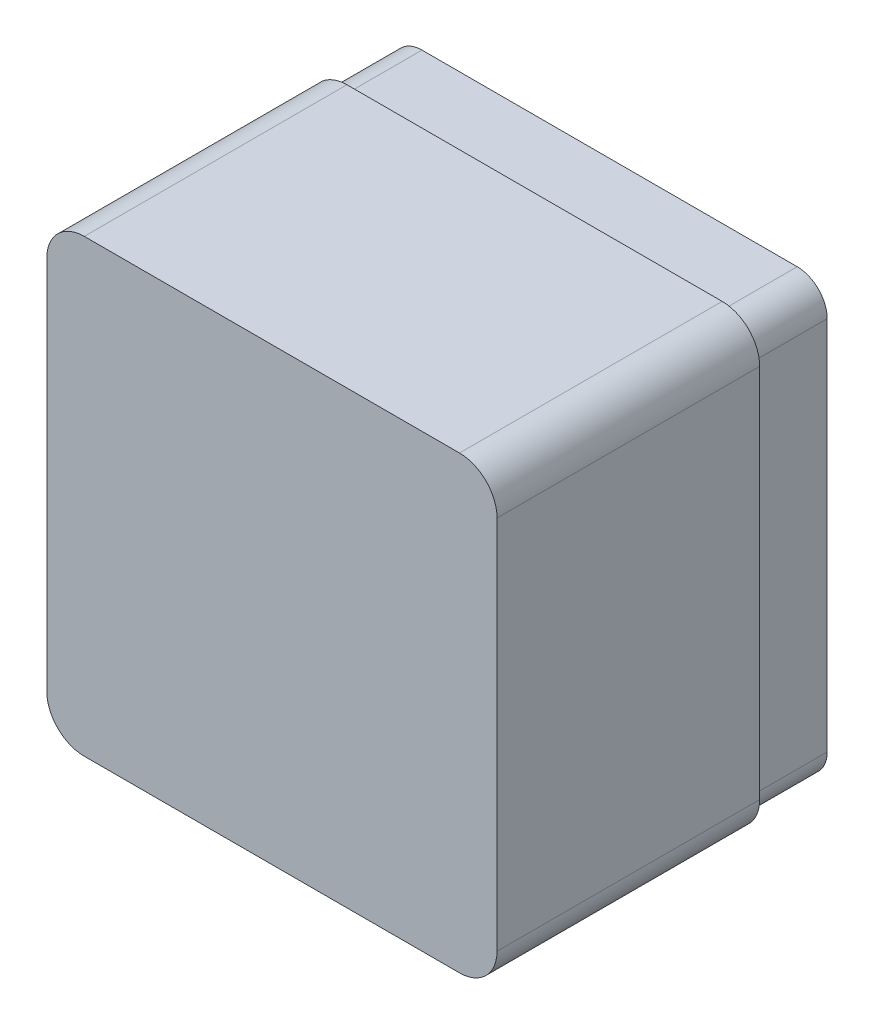
ISO-10303-21;
HEADER;
FILE_DESCRIPTION(('STEP AP214'),'2;1');
FILE_NAME('part.step','',(''),(''),'','','');
FILE_SCHEMA(('AUTOMOTIVE_DESIGN { 1 0 10303 214 1 1 1 1 }'));
ENDSEC;
DATA;
#1=APPLICATION_CONTEXT('core data for automotive mechanical design processes');
#2=APPLICATION_PROTOCOL_DEFINITION('international standard','automotive_design',2000,#1);
#3=PRODUCT_CONTEXT('',#1,'mechanical');
#4=PRODUCT('Part','Part','',(#3));
#5=PRODUCT_RELATED_PRODUCT_CATEGORY('part','',(#4));
#6=PRODUCT_DEFINITION_FORMATION('','',#4);
#7=PRODUCT_DEFINITION_CONTEXT('part definition',#1,'design');
#8=PRODUCT_DEFINITION('design','',#6,#7);
#9=PRODUCT_DEFINITION_SHAPE('','',#8);
#10=(LENGTH_UNIT() NAMED_UNIT(*) SI_UNIT(.MILLI.,.METRE.));
#11=(NAMED_UNIT(*) PLANE_ANGLE_UNIT() SI_UNIT($,.RADIAN.));
#12=(NAMED_UNIT(*) SI_UNIT($,.STERADIAN.) SOLID_ANGLE_UNIT());
#13=UNCERTAINTY_MEASURE_WITH_UNIT(LENGTH_MEASURE(1.E-05),#10,'distance_accuracy_value','');
#14=(GEOMETRIC_REPRESENTATION_CONTEXT(3) GLOBAL_UNCERTAINTY_ASSIGNED_CONTEXT((#13)) GLOBAL_UNIT_ASSIGNED_CONTEXT((#10,
#11,#12)) REPRESENTATION_CONTEXT('',''));
#15=CARTESIAN_POINT('',(0.,0.,0.));
#16=DIRECTION('',(0.,0.,1.));
#17=DIRECTION('',(1.,0.,0.));
#18=AXIS2_PLACEMENT_3D('',#15,#16,#17);
#19=CARTESIAN_POINT('',(0.,0.,0.));
#20=DIRECTION('',(0.,0.,-1.));
#21=DIRECTION('',(-1.,0.,0.));
#22=AXIS2_PLACEMENT_3D('',#19,#20,#21);
#23=PLANE('',#22);
#24=CARTESIAN_POINT('',(-50.,50.,0.));
#25=DIRECTION('',(0.,0.,-1.));
#26=DIRECTION('',(-1.,0.,0.));
#27=AXIS2_PLACEMENT_3D('',#24,#25,#26);
#28=CIRCLE('',#27,6.);
#29=CARTESIAN_POINT('',(-56.,50.,0.));
#30=VERTEX_POINT('',#29);
#31=CARTESIAN_POINT('',(-50.,56.,0.));
#32=VERTEX_POINT('',#31);
#33=EDGE_CURVE('E369',#30,#32,#28,.T.);
#34=ORIENTED_EDGE('',*,*,#33,.F.);
#35=DIRECTION('',(0.,-1.,0.));
#36=VECTOR('',#35,1.);
#37=CARTESIAN_POINT('',(-56.,0.,0.));
#38=LINE('',#37,#36);
#39=CARTESIAN_POINT('',(-56.,-50.,0.));
#40=VERTEX_POINT('',#39);
#41=EDGE_CURVE('E392',#30,#40,#38,.T.);
#42=ORIENTED_EDGE('',*,*,#41,.T.);
#43=CARTESIAN_POINT('',(-50.,-50.,0.));
#44=DIRECTION('',(0.,0.,-1.));
#45=DIRECTION('',(-1.,0.,0.));
#46=AXIS2_PLACEMENT_3D('',#43,#44,#45);
#47=CIRCLE('',#46,6.);
#48=CARTESIAN_POINT('',(-50.,-56.,0.));
#49=VERTEX_POINT('',#48);
#50=EDGE_CURVE('E388',#49,#40,#47,.T.);
#51=ORIENTED_EDGE('',*,*,#50,.F.);
#52=DIRECTION('',(1.,0.,0.));
#53=VECTOR('',#52,1.);
#54=CARTESIAN_POINT('',(0.,-56.,0.));
#55=LINE('',#54,#53);
#56=CARTESIAN_POINT('',(50.,-56.,0.));
#57=VERTEX_POINT('',#56);
#58=EDGE_CURVE('E329',#49,#57,#55,.T.);
#59=ORIENTED_EDGE('',*,*,#58,.T.);
#60=CARTESIAN_POINT('',(50.,-50.,0.));
#61=DIRECTION('',(0.,0.,-1.));
#62=DIRECTION('',(-1.,0.,0.));
#63=AXIS2_PLACEMENT_3D('',#60,#61,#62);
#64=CIRCLE('',#63,6.);
#65=CARTESIAN_POINT('',(56.,-50.,0.));
#66=VERTEX_POINT('',#65);
#67=EDGE_CURVE('E385',#66,#57,#64,.T.);
#68=ORIENTED_EDGE('',*,*,#67,.F.);
#69=DIRECTION('',(0.,1.,0.));
#70=VECTOR('',#69,1.);
#71=CARTESIAN_POINT('',(56.,0.,0.));
#72=LINE('',#71,#70);
#73=CARTESIAN_POINT('',(56.,50.,0.));
#74=VERTEX_POINT('',#73);
#75=EDGE_CURVE('E323',#66,#74,#72,.T.);
#76=ORIENTED_EDGE('',*,*,#75,.T.);
#77=CARTESIAN_POINT('',(50.,50.,0.));
#78=DIRECTION('',(0.,0.,-1.));
#79=DIRECTION('',(-1.,0.,0.));
#80=AXIS2_PLACEMENT_3D('',#77,#78,#79);
#81=CIRCLE('',#80,6.);
#82=CARTESIAN_POINT('',(50.,56.,0.));
#83=VERTEX_POINT('',#82);
#84=EDGE_CURVE('E373',#83,#74,#81,.T.);
#85=ORIENTED_EDGE('',*,*,#84,.F.);
#86=DIRECTION('',(-1.,0.,0.));
#87=VECTOR('',#86,1.);
#88=CARTESIAN_POINT('',(0.,56.,0.));
#89=LINE('',#88,#87);
#90=EDGE_CURVE('E384',#83,#32,#89,.T.);
#91=ORIENTED_EDGE('',*,*,#90,.T.);
#92=EDGE_LOOP('',(#34,#42,#51,#59,#68,#76,#85,#91));
#93=FACE_BOUND('',#92,.T.);
#94=DIRECTION('',(-1.,0.,0.));
#95=VECTOR('',#94,1.);
#96=CARTESIAN_POINT('',(50.,-58.,0.));
#97=LINE('',#96,#95);
#98=CARTESIAN_POINT('',(50.,-58.,0.));
#99=VERTEX_POINT('',#98);
#100=CARTESIAN_POINT('',(-50.,-58.,0.));
#101=VERTEX_POINT('',#100);
#102=EDGE_CURVE('E232',#99,#101,#97,.T.);
#103=ORIENTED_EDGE('',*,*,#102,.T.);
#104=CARTESIAN_POINT('',(-50.,-50.,0.));
#105=DIRECTION('',(0.,0.,-1.));
#106=DIRECTION('',(-1.,0.,0.));
#107=AXIS2_PLACEMENT_3D('',#104,#105,#106);
#108=CIRCLE('',#107,7.99999999999999);
#109=CARTESIAN_POINT('',(-58.,-50.,0.));
#110=VERTEX_POINT('',#109);
#111=EDGE_CURVE('E259',#101,#110,#108,.T.);
#112=ORIENTED_EDGE('',*,*,#111,.T.);
#113=DIRECTION('',(0.,1.,0.));
#114=VECTOR('',#113,1.);
#115=CARTESIAN_POINT('',(-58.,-50.,0.));
#116=LINE('',#115,#114);
#117=CARTESIAN_POINT('',(-58.,50.,0.));
#118=VERTEX_POINT('',#117);
#119=EDGE_CURVE('E209',#110,#118,#116,.T.);
#120=ORIENTED_EDGE('',*,*,#119,.T.);
#121=CARTESIAN_POINT('',(-50.,50.,0.));
#122=DIRECTION('',(0.,0.,-1.));
#123=DIRECTION('',(-1.,0.,0.));
#124=AXIS2_PLACEMENT_3D('',#121,#122,#123);
#125=CIRCLE('',#124,7.99999999999999);
#126=CARTESIAN_POINT('',(-50.,58.,0.));
#127=VERTEX_POINT('',#126);
#128=EDGE_CURVE('E58',#118,#127,#125,.T.);
#129=ORIENTED_EDGE('',*,*,#128,.T.);
#130=DIRECTION('',(1.,0.,0.));
#131=VECTOR('',#130,1.);
#132=CARTESIAN_POINT('',(-50.,58.,0.));
#133=LINE('',#132,#131);
#134=CARTESIAN_POINT('',(50.,58.,0.));
#135=VERTEX_POINT('',#134);
#136=EDGE_CURVE('E266',#127,#135,#133,.T.);
#137=ORIENTED_EDGE('',*,*,#136,.T.);
#138=CARTESIAN_POINT('',(50.,50.,0.));
#139=DIRECTION('',(0.,0.,-1.));
#140=DIRECTION('',(-1.,0.,0.));
#141=AXIS2_PLACEMENT_3D('',#138,#139,#140);
#142=CIRCLE('',#141,7.99999999999999);
#143=CARTESIAN_POINT('',(58.,50.,0.));
#144=VERTEX_POINT('',#143);
#145=EDGE_CURVE('E270',#135,#144,#142,.T.);
#146=ORIENTED_EDGE('',*,*,#145,.T.);
#147=DIRECTION('',(0.,-1.,0.));
#148=VECTOR('',#147,1.);
#149=CARTESIAN_POINT('',(58.,50.,0.));
#150=LINE('',#149,#148);
#151=CARTESIAN_POINT('',(58.,-50.,0.));
#152=VERTEX_POINT('',#151);
#153=EDGE_CURVE('E274',#144,#152,#150,.T.);
#154=ORIENTED_EDGE('',*,*,#153,.T.);
#155=CARTESIAN_POINT('',(50.,-50.,0.));
#156=DIRECTION('',(0.,0.,-1.));
#157=DIRECTION('',(-1.,0.,0.));
#158=AXIS2_PLACEMENT_3D('',#155,#156,#157);
#159=CIRCLE('',#158,7.99999999999999);
#160=EDGE_CURVE('E236',#152,#99,#159,.T.);
#161=ORIENTED_EDGE('',*,*,#160,.T.);
#162=EDGE_LOOP('',(#103,#112,#120,#129,#137,#146,#154,#161));
#163=FACE_BOUND('',#162,.T.);
#164=ADVANCED_FACE('F42',(#93,#163),#23,.T.);
#165=CARTESIAN_POINT('',(56.,-60.,90.));
#166=DIRECTION('',(-1.,0.,0.));
#167=DIRECTION('',(0.,0.,1.));
#168=AXIS2_PLACEMENT_3D('',#165,#166,#167);
#169=PLANE('',#168);
#170=DIRECTION('',(0.,1.,0.));
#171=VECTOR('',#170,1.);
#172=CARTESIAN_POINT('',(56.,0.,86.));
#173=LINE('',#172,#171);
#174=CARTESIAN_POINT('',(56.,-50.,86.));
#175=VERTEX_POINT('',#174);
#176=CARTESIAN_POINT('',(56.,50.,86.));
#177=VERTEX_POINT('',#176);
#178=EDGE_CURVE('E324',#175,#177,#173,.T.);
#179=ORIENTED_EDGE('',*,*,#178,.T.);
#180=DIRECTION('',(0.,0.,1.));
#181=VECTOR('',#180,1.);
#182=CARTESIAN_POINT('',(56.,50.,90.));
#183=LINE('',#182,#181);
#184=EDGE_CURVE('E334',#74,#177,#183,.T.);
#185=ORIENTED_EDGE('',*,*,#184,.F.);
#186=ORIENTED_EDGE('',*,*,#75,.F.);
#187=DIRECTION('',(0.,0.,1.));
#188=VECTOR('',#187,1.);
#189=CARTESIAN_POINT('',(56.,-50.,90.));
#190=LINE('',#189,#188);
#191=EDGE_CURVE('E330',#175,#66,#190,.F.);
#192=ORIENTED_EDGE('',*,*,#191,.F.);
#193=EDGE_LOOP('',(#179,#185,#186,#192));
#194=FACE_BOUND('',#193,.T.);
#195=ADVANCED_FACE('F504',(#194),#169,.T.);
#196=CARTESIAN_POINT('',(-60.,56.,90.));
#197=DIRECTION('',(0.,-1.,0.));
#198=DIRECTION('',(0.,0.,-1.));
#199=AXIS2_PLACEMENT_3D('',#196,#197,#198);
#200=PLANE('',#199);
#201=ORIENTED_EDGE('',*,*,#90,.F.);
#202=DIRECTION('',(0.,0.,-1.));
#203=VECTOR('',#202,1.);
#204=CARTESIAN_POINT('',(50.,56.,90.));
#205=LINE('',#204,#203);
#206=CARTESIAN_POINT('',(50.,56.,86.));
#207=VERTEX_POINT('',#206);
#208=EDGE_CURVE('E366',#207,#83,#205,.T.);
#209=ORIENTED_EDGE('',*,*,#208,.F.);
#210=DIRECTION('',(-1.,0.,0.));
#211=VECTOR('',#210,1.);
#212=CARTESIAN_POINT('',(0.,56.,86.));
#213=LINE('',#212,#211);
#214=CARTESIAN_POINT('',(-50.,56.,86.));
#215=VERTEX_POINT('',#214);
#216=EDGE_CURVE('E328',#207,#215,#213,.T.);
#217=ORIENTED_EDGE('',*,*,#216,.T.);
#218=DIRECTION('',(0.,0.,-1.));
#219=VECTOR('',#218,1.);
#220=CARTESIAN_POINT('',(-50.,56.,90.));
#221=LINE('',#220,#219);
#222=EDGE_CURVE('E363',#32,#215,#221,.F.);
#223=ORIENTED_EDGE('',*,*,#222,.F.);
#224=EDGE_LOOP('',(#201,#209,#217,#223));
#225=FACE_BOUND('',#224,.T.);
#226=ADVANCED_FACE('F509',(#225),#200,.T.);
#227=CARTESIAN_POINT('',(-56.,-60.,90.));
#228=DIRECTION('',(1.,0.,0.));
#229=DIRECTION('',(0.,0.,-1.));
#230=AXIS2_PLACEMENT_3D('',#227,#228,#229);
#231=PLANE('',#230);
#232=DIRECTION('',(0.,-1.,0.));
#233=VECTOR('',#232,1.);
#234=CARTESIAN_POINT('',(-56.,0.,86.));
#235=LINE('',#234,#233);
#236=CARTESIAN_POINT('',(-56.,50.,86.));
#237=VERTEX_POINT('',#236);
#238=CARTESIAN_POINT('',(-56.,-50.,86.));
#239=VERTEX_POINT('',#238);
#240=EDGE_CURVE('E341',#237,#239,#235,.T.);
#241=ORIENTED_EDGE('',*,*,#240,.T.);
#242=DIRECTION('',(0.,0.,-1.));
#243=VECTOR('',#242,1.);
#244=CARTESIAN_POINT('',(-56.,-50.,90.));
#245=LINE('',#244,#243);
#246=EDGE_CURVE('E357',#40,#239,#245,.F.);
#247=ORIENTED_EDGE('',*,*,#246,.F.);
#248=ORIENTED_EDGE('',*,*,#41,.F.);
#249=DIRECTION('',(0.,0.,-1.));
#250=VECTOR('',#249,1.);
#251=CARTESIAN_POINT('',(-56.,50.,90.));
#252=LINE('',#251,#250);
#253=EDGE_CURVE('E370',#237,#30,#252,.T.);
#254=ORIENTED_EDGE('',*,*,#253,.F.);
#255=EDGE_LOOP('',(#241,#247,#248,#254));
#256=FACE_BOUND('',#255,.T.);
#257=ADVANCED_FACE('F702',(#256),#231,.T.);
#258=CARTESIAN_POINT('',(-60.,-56.,90.));
#259=DIRECTION('',(0.,1.,0.));
#260=DIRECTION('',(0.,0.,1.));
#261=AXIS2_PLACEMENT_3D('',#258,#259,#260);
#262=PLANE('',#261);
#263=DIRECTION('',(1.,0.,0.));
#264=VECTOR('',#263,1.);
#265=CARTESIAN_POINT('',(0.,-56.,86.));
#266=LINE('',#265,#264);
#267=CARTESIAN_POINT('',(-50.,-56.,86.));
#268=VERTEX_POINT('',#267);
#269=CARTESIAN_POINT('',(50.,-56.,86.));
#270=VERTEX_POINT('',#269);
#271=EDGE_CURVE('E350',#268,#270,#266,.T.);
#272=ORIENTED_EDGE('',*,*,#271,.T.);
#273=DIRECTION('',(0.,0.,1.));
#274=VECTOR('',#273,1.);
#275=CARTESIAN_POINT('',(50.,-56.,90.));
#276=LINE('',#275,#274);
#277=EDGE_CURVE('E345',#57,#270,#276,.T.);
#278=ORIENTED_EDGE('',*,*,#277,.F.);
#279=ORIENTED_EDGE('',*,*,#58,.F.);
#280=DIRECTION('',(0.,0.,1.));
#281=VECTOR('',#280,1.);
#282=CARTESIAN_POINT('',(-50.,-56.,90.));
#283=LINE('',#282,#281);
#284=EDGE_CURVE('E337',#268,#49,#283,.F.);
#285=ORIENTED_EDGE('',*,*,#284,.F.);
#286=EDGE_LOOP('',(#272,#278,#279,#285));
#287=FACE_BOUND('',#286,.T.);
#288=ADVANCED_FACE('F693',(#287),#262,.T.);
#289=CARTESIAN_POINT('',(0.,0.,86.));
#290=DIRECTION('',(0.,0.,-1.));
#291=DIRECTION('',(-1.,0.,0.));
#292=AXIS2_PLACEMENT_3D('',#289,#290,#291);
#293=PLANE('',#292);
#294=ORIENTED_EDGE('',*,*,#216,.F.);
#295=CARTESIAN_POINT('',(50.,50.,86.));
#296=DIRECTION('',(0.,0.,-1.));
#297=DIRECTION('',(-1.,0.,0.));
#298=AXIS2_PLACEMENT_3D('',#295,#296,#297);
#299=CIRCLE('',#298,6.);
#300=EDGE_CURVE('E360',#177,#207,#299,.F.);
#301=ORIENTED_EDGE('',*,*,#300,.F.);
#302=ORIENTED_EDGE('',*,*,#178,.F.);
#303=CARTESIAN_POINT('',(50.,-50.,86.));
#304=DIRECTION('',(0.,0.,-1.));
#305=DIRECTION('',(-1.,0.,0.));
#306=AXIS2_PLACEMENT_3D('',#303,#304,#305);
#307=CIRCLE('',#306,6.);
#308=EDGE_CURVE('E353',#270,#175,#307,.F.);
#309=ORIENTED_EDGE('',*,*,#308,.F.);
#310=ORIENTED_EDGE('',*,*,#271,.F.);
#311=CARTESIAN_POINT('',(-50.,-50.,86.));
#312=DIRECTION('',(0.,0.,-1.));
#313=DIRECTION('',(-1.,0.,0.));
#314=AXIS2_PLACEMENT_3D('',#311,#312,#313);
#315=CIRCLE('',#314,6.);
#316=EDGE_CURVE('E346',#239,#268,#315,.F.);
#317=ORIENTED_EDGE('',*,*,#316,.F.);
#318=ORIENTED_EDGE('',*,*,#240,.F.);
#319=CARTESIAN_POINT('',(-50.,50.,86.));
#320=DIRECTION('',(0.,0.,-1.));
#321=DIRECTION('',(-1.,0.,0.));
#322=AXIS2_PLACEMENT_3D('',#319,#320,#321);
#323=CIRCLE('',#322,6.);
#324=EDGE_CURVE('E342',#215,#237,#323,.F.);
#325=ORIENTED_EDGE('',*,*,#324,.F.);
#326=EDGE_LOOP('',(#294,#301,#302,#309,#310,#317,#318,#325));
#327=FACE_BOUND('',#326,.T.);
#328=ADVANCED_FACE('F684',(#327),#293,.T.);
#329=CARTESIAN_POINT('',(-50.,50.,90.));
#330=DIRECTION('',(0.,0.,-1.));
#331=DIRECTION('',(-1.,0.,0.));
#332=AXIS2_PLACEMENT_3D('',#329,#330,#331);
#333=CYLINDRICAL_SURFACE('',#332,6.);
#334=ORIENTED_EDGE('',*,*,#324,.T.);
#335=ORIENTED_EDGE('',*,*,#253,.T.);
#336=ORIENTED_EDGE('',*,*,#33,.T.);
#337=ORIENTED_EDGE('',*,*,#222,.T.);
#338=EDGE_LOOP('',(#334,#335,#336,#337));
#339=FACE_BOUND('',#338,.T.);
#340=ADVANCED_FACE('F675',(#339),#333,.F.);
#341=CARTESIAN_POINT('',(-50.,-50.,90.));
#342=DIRECTION('',(0.,0.,-1.));
#343=DIRECTION('',(-1.,0.,0.));
#344=AXIS2_PLACEMENT_3D('',#341,#342,#343);
#345=CYLINDRICAL_SURFACE('',#344,6.);
#346=ORIENTED_EDGE('',*,*,#316,.T.);
#347=ORIENTED_EDGE('',*,*,#284,.T.);
#348=ORIENTED_EDGE('',*,*,#50,.T.);
#349=ORIENTED_EDGE('',*,*,#246,.T.);
#350=EDGE_LOOP('',(#346,#347,#348,#349));
#351=FACE_BOUND('',#350,.T.);
#352=ADVANCED_FACE('F666',(#351),#345,.F.);
#353=CARTESIAN_POINT('',(50.,-50.,90.));
#354=DIRECTION('',(0.,0.,-1.));
#355=DIRECTION('',(-1.,0.,0.));
#356=AXIS2_PLACEMENT_3D('',#353,#354,#355);
#357=CYLINDRICAL_SURFACE('',#356,6.);
#358=ORIENTED_EDGE('',*,*,#308,.T.);
#359=ORIENTED_EDGE('',*,*,#191,.T.);
#360=ORIENTED_EDGE('',*,*,#67,.T.);
#361=ORIENTED_EDGE('',*,*,#277,.T.);
#362=EDGE_LOOP('',(#358,#359,#360,#361));
#363=FACE_BOUND('',#362,.T.);
#364=ADVANCED_FACE('F658',(#363),#357,.F.);
#365=CARTESIAN_POINT('',(50.,50.,90.));
#366=DIRECTION('',(0.,0.,-1.));
#367=DIRECTION('',(-1.,0.,0.));
#368=AXIS2_PLACEMENT_3D('',#365,#366,#367);
#369=CYLINDRICAL_SURFACE('',#368,6.);
#370=ORIENTED_EDGE('',*,*,#300,.T.);
#371=ORIENTED_EDGE('',*,*,#208,.T.);
#372=ORIENTED_EDGE('',*,*,#84,.T.);
#373=ORIENTED_EDGE('',*,*,#184,.T.);
#374=EDGE_LOOP('',(#370,#371,#372,#373));
#375=FACE_BOUND('',#374,.T.);
#376=ADVANCED_FACE('F564',(#375),#369,.F.);
#377=CARTESIAN_POINT('',(0.,0.,20.));
#378=DIRECTION('',(0.,0.,-1.));
#379=DIRECTION('',(-1.,0.,0.));
#380=AXIS2_PLACEMENT_3D('',#377,#378,#379);
#381=PLANE('',#380);
#382=DIRECTION('',(0.,1.,0.));
#383=VECTOR('',#382,1.);
#384=CARTESIAN_POINT('',(-60.,-60.,20.));
#385=LINE('',#384,#383);
#386=CARTESIAN_POINT('',(-60.,-50.,20.));
#387=VERTEX_POINT('',#386);
#388=CARTESIAN_POINT('',(-60.,50.,20.));
#389=VERTEX_POINT('',#388);
#390=EDGE_CURVE('E316',#387,#389,#385,.T.);
#391=ORIENTED_EDGE('',*,*,#390,.T.);
#392=CARTESIAN_POINT('',(-50.,50.,20.));
#393=DIRECTION('',(0.,0.,-1.));
#394=DIRECTION('',(-1.,0.,0.));
#395=AXIS2_PLACEMENT_3D('',#392,#393,#394);
#396=CIRCLE('',#395,10.);
#397=CARTESIAN_POINT('',(-50.,60.,20.));
#398=VERTEX_POINT('',#397);
#399=EDGE_CURVE('E309',#398,#389,#396,.F.);
#400=ORIENTED_EDGE('',*,*,#399,.F.);
#401=DIRECTION('',(1.,0.,0.));
#402=VECTOR('',#401,1.);
#403=CARTESIAN_POINT('',(-60.,60.,20.));
#404=LINE('',#403,#402);
#405=CARTESIAN_POINT('',(50.,60.,20.));
#406=VERTEX_POINT('',#405);
#407=EDGE_CURVE('E66',#398,#406,#404,.T.);
#408=ORIENTED_EDGE('',*,*,#407,.T.);
#409=CARTESIAN_POINT('',(50.,50.,20.));
#410=DIRECTION('',(0.,0.,-1.));
#411=DIRECTION('',(-1.,0.,0.));
#412=AXIS2_PLACEMENT_3D('',#409,#410,#411);
#413=CIRCLE('',#412,10.);
#414=CARTESIAN_POINT('',(60.,50.,20.));
#415=VERTEX_POINT('',#414);
#416=EDGE_CURVE('E12',#415,#406,#413,.F.);
#417=ORIENTED_EDGE('',*,*,#416,.F.);
#418=DIRECTION('',(0.,-1.,0.));
#419=VECTOR('',#418,1.);
#420=CARTESIAN_POINT('',(60.,-60.,20.));
#421=LINE('',#420,#419);
#422=CARTESIAN_POINT('',(60.,-50.,20.));
#423=VERTEX_POINT('',#422);
#424=EDGE_CURVE('E302',#415,#423,#421,.T.);
#425=ORIENTED_EDGE('',*,*,#424,.T.);
#426=CARTESIAN_POINT('',(50.,-50.,20.));
#427=DIRECTION('',(0.,0.,-1.));
#428=DIRECTION('',(-1.,0.,0.));
#429=AXIS2_PLACEMENT_3D('',#426,#427,#428);
#430=CIRCLE('',#429,10.);
#431=CARTESIAN_POINT('',(50.,-60.,20.));
#432=VERTEX_POINT('',#431);
#433=EDGE_CURVE('E305',#432,#423,#430,.F.);
#434=ORIENTED_EDGE('',*,*,#433,.F.);
#435=DIRECTION('',(-1.,0.,0.));
#436=VECTOR('',#435,1.);
#437=CARTESIAN_POINT('',(-60.,-60.,20.));
#438=LINE('',#437,#436);
#439=CARTESIAN_POINT('',(-50.,-60.,20.));
#440=VERTEX_POINT('',#439);
#441=EDGE_CURVE('E313',#432,#440,#438,.T.);
#442=ORIENTED_EDGE('',*,*,#441,.T.);
#443=CARTESIAN_POINT('',(-50.,-50.,20.));
#444=DIRECTION('',(0.,0.,-1.));
#445=DIRECTION('',(-1.,0.,0.));
#446=AXIS2_PLACEMENT_3D('',#443,#444,#445);
#447=CIRCLE('',#446,10.);
#448=EDGE_CURVE('E319',#387,#440,#447,.F.);
#449=ORIENTED_EDGE('',*,*,#448,.F.);
#450=EDGE_LOOP('',(#391,#400,#408,#417,#425,#434,#442,#449));
#451=FACE_BOUND('',#450,.T.);
#452=DIRECTION('',(-1.,0.,0.));
#453=VECTOR('',#452,1.);
#454=CARTESIAN_POINT('',(50.,-58.,20.));
#455=LINE('',#454,#453);
#456=CARTESIAN_POINT('',(50.,-58.,20.));
#457=VERTEX_POINT('',#456);
#458=CARTESIAN_POINT('',(-50.,-58.,20.));
#459=VERTEX_POINT('',#458);
#460=EDGE_CURVE('E216',#457,#459,#455,.T.);
#461=ORIENTED_EDGE('',*,*,#460,.F.);
#462=CARTESIAN_POINT('',(50.,-50.,20.));
#463=DIRECTION('',(0.,0.,-1.));
#464=DIRECTION('',(-1.,0.,0.));
#465=AXIS2_PLACEMENT_3D('',#462,#463,#464);
#466=CIRCLE('',#465,7.99999999999999);
#467=CARTESIAN_POINT('',(58.,-50.,20.));
#468=VERTEX_POINT('',#467);
#469=EDGE_CURVE('E253',#468,#457,#466,.T.);
#470=ORIENTED_EDGE('',*,*,#469,.F.);
#471=DIRECTION('',(0.,-1.,0.));
#472=VECTOR('',#471,1.);
#473=CARTESIAN_POINT('',(58.,50.,20.));
#474=LINE('',#473,#472);
#475=CARTESIAN_POINT('',(58.,50.,20.));
#476=VERTEX_POINT('',#475);
#477=EDGE_CURVE('E249',#476,#468,#474,.T.);
#478=ORIENTED_EDGE('',*,*,#477,.F.);
#479=CARTESIAN_POINT('',(50.,50.,20.));
#480=DIRECTION('',(0.,0.,-1.));
#481=DIRECTION('',(-1.,0.,0.));
#482=AXIS2_PLACEMENT_3D('',#479,#480,#481);
#483=CIRCLE('',#482,7.99999999999999);
#484=CARTESIAN_POINT('',(50.,58.,20.));
#485=VERTEX_POINT('',#484);
#486=EDGE_CURVE('E245',#485,#476,#483,.T.);
#487=ORIENTED_EDGE('',*,*,#486,.F.);
#488=DIRECTION('',(1.,0.,0.));
#489=VECTOR('',#488,1.);
#490=CARTESIAN_POINT('',(-50.,58.,20.));
#491=LINE('',#490,#489);
#492=CARTESIAN_POINT('',(-50.,58.,20.));
#493=VERTEX_POINT('',#492);
#494=EDGE_CURVE('E241',#493,#485,#491,.T.);
#495=ORIENTED_EDGE('',*,*,#494,.F.);
#496=CARTESIAN_POINT('',(-50.,50.,20.));
#497=DIRECTION('',(0.,0.,-1.));
#498=DIRECTION('',(-1.,0.,0.));
#499=AXIS2_PLACEMENT_3D('',#496,#497,#498);
#500=CIRCLE('',#499,7.99999999999999);
#501=CARTESIAN_POINT('',(-58.,50.,20.));
#502=VERTEX_POINT('',#501);
#503=EDGE_CURVE('E226',#502,#493,#500,.T.);
#504=ORIENTED_EDGE('',*,*,#503,.F.);
#505=DIRECTION('',(0.,1.,0.));
#506=VECTOR('',#505,1.);
#507=CARTESIAN_POINT('',(-58.,-50.,20.));
#508=LINE('',#507,#506);
#509=CARTESIAN_POINT('',(-58.,-50.,20.));
#510=VERTEX_POINT('',#509);
#511=EDGE_CURVE('E207',#510,#502,#508,.T.);
#512=ORIENTED_EDGE('',*,*,#511,.F.);
#513=CARTESIAN_POINT('',(-50.,-50.,20.));
#514=DIRECTION('',(0.,0.,-1.));
#515=DIRECTION('',(-1.,0.,0.));
#516=AXIS2_PLACEMENT_3D('',#513,#514,#515);
#517=CIRCLE('',#516,7.99999999999999);
#518=EDGE_CURVE('E222',#459,#510,#517,.T.);
#519=ORIENTED_EDGE('',*,*,#518,.F.);
#520=EDGE_LOOP('',(#461,#470,#478,#487,#495,#504,#512,#519));
#521=FACE_BOUND('',#520,.T.);
#522=ADVANCED_FACE('F221',(#451,#521),#381,.T.);
#523=CARTESIAN_POINT('',(-50.,-50.,20.));
#524=DIRECTION('',(0.,0.,-1.));
#525=DIRECTION('',(-1.,0.,0.));
#526=AXIS2_PLACEMENT_3D('',#523,#524,#525);
#527=CYLINDRICAL_SURFACE('',#526,7.99999999999999);
#528=ORIENTED_EDGE('',*,*,#111,.F.);
#529=DIRECTION('',(0.,0.,-1.));
#530=VECTOR('',#529,1.);
#531=CARTESIAN_POINT('',(-50.,-58.,20.));
#532=LINE('',#531,#530);
#533=EDGE_CURVE('E230',#459,#101,#532,.T.);
#534=ORIENTED_EDGE('',*,*,#533,.F.);
#535=ORIENTED_EDGE('',*,*,#518,.T.);
#536=DIRECTION('',(0.,0.,-1.));
#537=VECTOR('',#536,1.);
#538=CARTESIAN_POINT('',(-58.,-50.,20.));
#539=LINE('',#538,#537);
#540=EDGE_CURVE('E204',#510,#110,#539,.T.);
#541=ORIENTED_EDGE('',*,*,#540,.T.);
#542=EDGE_LOOP('',(#528,#534,#535,#541));
#543=FACE_BOUND('',#542,.T.);
#544=ADVANCED_FACE('F229',(#543),#527,.T.);
#545=CARTESIAN_POINT('',(50.,-58.,20.));
#546=DIRECTION('',(0.,-1.,0.));
#547=DIRECTION('',(0.,0.,-1.));
#548=AXIS2_PLACEMENT_3D('',#545,#546,#547);
#549=PLANE('',#548);
#550=ORIENTED_EDGE('',*,*,#102,.F.);
#551=DIRECTION('',(0.,0.,-1.));
#552=VECTOR('',#551,1.);
#553=CARTESIAN_POINT('',(50.,-58.,20.));
#554=LINE('',#553,#552);
#555=EDGE_CURVE('E283',#457,#99,#554,.T.);
#556=ORIENTED_EDGE('',*,*,#555,.F.);
#557=ORIENTED_EDGE('',*,*,#460,.T.);
#558=ORIENTED_EDGE('',*,*,#533,.T.);
#559=EDGE_LOOP('',(#550,#556,#557,#558));
#560=FACE_BOUND('',#559,.T.);
#561=ADVANCED_FACE('F572',(#560),#549,.T.);
#562=CARTESIAN_POINT('',(50.,-50.,20.));
#563=DIRECTION('',(0.,0.,-1.));
#564=DIRECTION('',(-1.,0.,0.));
#565=AXIS2_PLACEMENT_3D('',#562,#563,#564);
#566=CYLINDRICAL_SURFACE('',#565,7.99999999999999);
#567=ORIENTED_EDGE('',*,*,#160,.F.);
#568=DIRECTION('',(0.,0.,-1.));
#569=VECTOR('',#568,1.);
#570=CARTESIAN_POINT('',(58.,-50.,20.));
#571=LINE('',#570,#569);
#572=EDGE_CURVE('E286',#468,#152,#571,.T.);
#573=ORIENTED_EDGE('',*,*,#572,.F.);
#574=ORIENTED_EDGE('',*,*,#469,.T.);
#575=ORIENTED_EDGE('',*,*,#555,.T.);
#576=EDGE_LOOP('',(#567,#573,#574,#575));
#577=FACE_BOUND('',#576,.T.);
#578=ADVANCED_FACE('F580',(#577),#566,.T.);
#579=CARTESIAN_POINT('',(58.,50.,20.));
#580=DIRECTION('',(1.,0.,0.));
#581=DIRECTION('',(0.,0.,-1.));
#582=AXIS2_PLACEMENT_3D('',#579,#580,#581);
#583=PLANE('',#582);
#584=ORIENTED_EDGE('',*,*,#153,.F.);
#585=DIRECTION('',(0.,0.,-1.));
#586=VECTOR('',#585,1.);
#587=CARTESIAN_POINT('',(58.,50.,20.));
#588=LINE('',#587,#586);
#589=EDGE_CURVE('E289',#476,#144,#588,.T.);
#590=ORIENTED_EDGE('',*,*,#589,.F.);
#591=ORIENTED_EDGE('',*,*,#477,.T.);
#592=ORIENTED_EDGE('',*,*,#572,.T.);
#593=EDGE_LOOP('',(#584,#590,#591,#592));
#594=FACE_BOUND('',#593,.T.);
#595=ADVANCED_FACE('F589',(#594),#583,.T.);
#596=CARTESIAN_POINT('',(50.,50.,20.));
#597=DIRECTION('',(0.,0.,-1.));
#598=DIRECTION('',(-1.,0.,0.));
#599=AXIS2_PLACEMENT_3D('',#596,#597,#598);
#600=CYLINDRICAL_SURFACE('',#599,7.99999999999999);
#601=ORIENTED_EDGE('',*,*,#145,.F.);
#602=DIRECTION('',(0.,0.,-1.));
#603=VECTOR('',#602,1.);
#604=CARTESIAN_POINT('',(50.,58.,20.));
#605=LINE('',#604,#603);
#606=EDGE_CURVE('E292',#485,#135,#605,.T.);
#607=ORIENTED_EDGE('',*,*,#606,.F.);
#608=ORIENTED_EDGE('',*,*,#486,.T.);
#609=ORIENTED_EDGE('',*,*,#589,.T.);
#610=EDGE_LOOP('',(#601,#607,#608,#609));
#611=FACE_BOUND('',#610,.T.);
#612=ADVANCED_FACE('F598',(#611),#600,.T.);
#613=CARTESIAN_POINT('',(-50.,58.,20.));
#614=DIRECTION('',(0.,1.,0.));
#615=DIRECTION('',(0.,0.,1.));
#616=AXIS2_PLACEMENT_3D('',#613,#614,#615);
#617=PLANE('',#616);
#618=ORIENTED_EDGE('',*,*,#136,.F.);
#619=DIRECTION('',(0.,0.,-1.));
#620=VECTOR('',#619,1.);
#621=CARTESIAN_POINT('',(-50.,58.,20.));
#622=LINE('',#621,#620);
#623=EDGE_CURVE('E295',#493,#127,#622,.T.);
#624=ORIENTED_EDGE('',*,*,#623,.F.);
#625=ORIENTED_EDGE('',*,*,#494,.T.);
#626=ORIENTED_EDGE('',*,*,#606,.T.);
#627=EDGE_LOOP('',(#618,#624,#625,#626));
#628=FACE_BOUND('',#627,.T.);
#629=ADVANCED_FACE('F607',(#628),#617,.T.);
#630=CARTESIAN_POINT('',(-50.,50.,20.));
#631=DIRECTION('',(0.,0.,-1.));
#632=DIRECTION('',(-1.,0.,0.));
#633=AXIS2_PLACEMENT_3D('',#630,#631,#632);
#634=CYLINDRICAL_SURFACE('',#633,7.99999999999999);
#635=ORIENTED_EDGE('',*,*,#128,.F.);
#636=DIRECTION('',(0.,0.,-1.));
#637=VECTOR('',#636,1.);
#638=CARTESIAN_POINT('',(-58.,50.,20.));
#639=LINE('',#638,#637);
#640=EDGE_CURVE('E215',#502,#118,#639,.T.);
#641=ORIENTED_EDGE('',*,*,#640,.F.);
#642=ORIENTED_EDGE('',*,*,#503,.T.);
#643=ORIENTED_EDGE('',*,*,#623,.T.);
#644=EDGE_LOOP('',(#635,#641,#642,#643));
#645=FACE_BOUND('',#644,.T.);
#646=ADVANCED_FACE('F499',(#645),#634,.T.);
#647=CARTESIAN_POINT('',(-58.,-50.,20.));
#648=DIRECTION('',(-1.,0.,0.));
#649=DIRECTION('',(0.,0.,1.));
#650=AXIS2_PLACEMENT_3D('',#647,#648,#649);
#651=PLANE('',#650);
#652=ORIENTED_EDGE('',*,*,#119,.F.);
#653=ORIENTED_EDGE('',*,*,#540,.F.);
#654=ORIENTED_EDGE('',*,*,#511,.T.);
#655=ORIENTED_EDGE('',*,*,#640,.T.);
#656=EDGE_LOOP('',(#652,#653,#654,#655));
#657=FACE_BOUND('',#656,.T.);
#658=ADVANCED_FACE('F206',(#657),#651,.T.);
#659=CARTESIAN_POINT('',(0.,0.,90.));
#660=DIRECTION('',(0.,0.,-1.));
#661=DIRECTION('',(-1.,0.,0.));
#662=AXIS2_PLACEMENT_3D('',#659,#660,#661);
#663=PLANE('',#662);
#664=DIRECTION('',(-1.,0.,0.));
#665=VECTOR('',#664,1.);
#666=CARTESIAN_POINT('',(-60.,60.,90.));
#667=LINE('',#666,#665);
#668=CARTESIAN_POINT('',(50.,60.,90.));
#669=VERTEX_POINT('',#668);
#670=CARTESIAN_POINT('',(-50.,60.,90.));
#671=VERTEX_POINT('',#670);
#672=EDGE_CURVE('E408',#669,#671,#667,.T.);
#673=ORIENTED_EDGE('',*,*,#672,.T.);
#674=CARTESIAN_POINT('',(-50.,50.,90.));
#675=DIRECTION('',(0.,0.,-1.));
#676=DIRECTION('',(-1.,0.,0.));
#677=AXIS2_PLACEMENT_3D('',#674,#675,#676);
#678=CIRCLE('',#677,10.);
#679=CARTESIAN_POINT('',(-60.,50.,90.));
#680=VERTEX_POINT('',#679);
#681=EDGE_CURVE('E443',#671,#680,#678,.F.);
#682=ORIENTED_EDGE('',*,*,#681,.T.);
#683=DIRECTION('',(0.,-1.,0.));
#684=VECTOR('',#683,1.);
#685=CARTESIAN_POINT('',(-60.,-60.,90.));
#686=LINE('',#685,#684);
#687=CARTESIAN_POINT('',(-60.,-50.,90.));
#688=VERTEX_POINT('',#687);
#689=EDGE_CURVE('E412',#680,#688,#686,.T.);
#690=ORIENTED_EDGE('',*,*,#689,.T.);
#691=CARTESIAN_POINT('',(-50.,-50.,90.));
#692=DIRECTION('',(0.,0.,-1.));
#693=DIRECTION('',(-1.,0.,0.));
#694=AXIS2_PLACEMENT_3D('',#691,#692,#693);
#695=CIRCLE('',#694,10.);
#696=CARTESIAN_POINT('',(-50.,-60.,90.));
#697=VERTEX_POINT('',#696);
#698=EDGE_CURVE('E440',#688,#697,#695,.F.);
#699=ORIENTED_EDGE('',*,*,#698,.T.);
#700=DIRECTION('',(1.,0.,0.));
#701=VECTOR('',#700,1.);
#702=CARTESIAN_POINT('',(-60.,-60.,90.));
#703=LINE('',#702,#701);
#704=CARTESIAN_POINT('',(50.,-60.,90.));
#705=VERTEX_POINT('',#704);
#706=EDGE_CURVE('E416',#697,#705,#703,.T.);
#707=ORIENTED_EDGE('',*,*,#706,.T.);
#708=CARTESIAN_POINT('',(50.,-50.,90.));
#709=DIRECTION('',(0.,0.,-1.));
#710=DIRECTION('',(-1.,0.,0.));
#711=AXIS2_PLACEMENT_3D('',#708,#709,#710);
#712=CIRCLE('',#711,10.);
#713=CARTESIAN_POINT('',(60.,-50.,90.));
#714=VERTEX_POINT('',#713);
#715=EDGE_CURVE('E437',#705,#714,#712,.F.);
#716=ORIENTED_EDGE('',*,*,#715,.T.);
#717=DIRECTION('',(0.,1.,0.));
#718=VECTOR('',#717,1.);
#719=CARTESIAN_POINT('',(60.,-60.,90.));
#720=LINE('',#719,#718);
#721=CARTESIAN_POINT('',(60.,50.,90.));
#722=VERTEX_POINT('',#721);
#723=EDGE_CURVE('E333',#714,#722,#720,.T.);
#724=ORIENTED_EDGE('',*,*,#723,.T.);
#725=CARTESIAN_POINT('',(50.,50.,90.));
#726=DIRECTION('',(0.,0.,-1.));
#727=DIRECTION('',(-1.,0.,0.));
#728=AXIS2_PLACEMENT_3D('',#725,#726,#727);
#729=CIRCLE('',#728,10.);
#730=EDGE_CURVE('E434',#722,#669,#729,.F.);
#731=ORIENTED_EDGE('',*,*,#730,.T.);
#732=EDGE_LOOP('',(#673,#682,#690,#699,#707,#716,#724,#731));
#733=FACE_BOUND('',#732,.T.);
#734=ADVANCED_FACE('F492',(#733),#663,.F.);
#735=CARTESIAN_POINT('',(50.,50.,90.));
#736=DIRECTION('',(0.,0.,-1.));
#737=DIRECTION('',(-1.,0.,0.));
#738=AXIS2_PLACEMENT_3D('',#735,#736,#737);
#739=CYLINDRICAL_SURFACE('',#738,10.);
#740=DIRECTION('',(0.,0.,-1.));
#741=VECTOR('',#740,1.);
#742=CARTESIAN_POINT('',(60.,50.,90.));
#743=LINE('',#742,#741);
#744=EDGE_CURVE('E453',#415,#722,#743,.F.);
#745=ORIENTED_EDGE('',*,*,#744,.F.);
#746=ORIENTED_EDGE('',*,*,#416,.T.);
#747=DIRECTION('',(0.,0.,-1.));
#748=VECTOR('',#747,1.);
#749=CARTESIAN_POINT('',(50.,60.,90.));
#750=LINE('',#749,#748);
#751=EDGE_CURVE('E427',#669,#406,#750,.T.);
#752=ORIENTED_EDGE('',*,*,#751,.F.);
#753=ORIENTED_EDGE('',*,*,#730,.F.);
#754=EDGE_LOOP('',(#745,#746,#752,#753));
#755=FACE_BOUND('',#754,.T.);
#756=ADVANCED_FACE('F44',(#755),#739,.T.);
#757=CARTESIAN_POINT('',(-50.,50.,90.));
#758=DIRECTION('',(0.,0.,-1.));
#759=DIRECTION('',(-1.,0.,0.));
#760=AXIS2_PLACEMENT_3D('',#757,#758,#759);
#761=CYLINDRICAL_SURFACE('',#760,10.);
#762=DIRECTION('',(0.,0.,-1.));
#763=VECTOR('',#762,1.);
#764=CARTESIAN_POINT('',(-50.,60.,90.));
#765=LINE('',#764,#763);
#766=EDGE_CURVE('E431',#398,#671,#765,.F.);
#767=ORIENTED_EDGE('',*,*,#766,.F.);
#768=ORIENTED_EDGE('',*,*,#399,.T.);
#769=DIRECTION('',(0.,0.,-1.));
#770=VECTOR('',#769,1.);
#771=CARTESIAN_POINT('',(-60.,50.,90.));
#772=LINE('',#771,#770);
#773=EDGE_CURVE('E423',#680,#389,#772,.T.);
#774=ORIENTED_EDGE('',*,*,#773,.F.);
#775=ORIENTED_EDGE('',*,*,#681,.F.);
#776=EDGE_LOOP('',(#767,#768,#774,#775));
#777=FACE_BOUND('',#776,.T.);
#778=ADVANCED_FACE('F484',(#777),#761,.T.);
#779=CARTESIAN_POINT('',(-50.,-50.,90.));
#780=DIRECTION('',(0.,0.,-1.));
#781=DIRECTION('',(-1.,0.,0.));
#782=AXIS2_PLACEMENT_3D('',#779,#780,#781);
#783=CYLINDRICAL_SURFACE('',#782,10.);
#784=DIRECTION('',(0.,0.,-1.));
#785=VECTOR('',#784,1.);
#786=CARTESIAN_POINT('',(-60.,-50.,90.));
#787=LINE('',#786,#785);
#788=EDGE_CURVE('E420',#387,#688,#787,.F.);
#789=ORIENTED_EDGE('',*,*,#788,.F.);
#790=ORIENTED_EDGE('',*,*,#448,.T.);
#791=DIRECTION('',(0.,0.,-1.));
#792=VECTOR('',#791,1.);
#793=CARTESIAN_POINT('',(-50.,-60.,90.));
#794=LINE('',#793,#792);
#795=EDGE_CURVE('E449',#697,#440,#794,.T.);
#796=ORIENTED_EDGE('',*,*,#795,.F.);
#797=ORIENTED_EDGE('',*,*,#698,.F.);
#798=EDGE_LOOP('',(#789,#790,#796,#797));
#799=FACE_BOUND('',#798,.T.);
#800=ADVANCED_FACE('F475',(#799),#783,.T.);
#801=CARTESIAN_POINT('',(50.,-50.,90.));
#802=DIRECTION('',(0.,0.,-1.));
#803=DIRECTION('',(-1.,0.,0.));
#804=AXIS2_PLACEMENT_3D('',#801,#802,#803);
#805=CYLINDRICAL_SURFACE('',#804,10.);
#806=DIRECTION('',(0.,0.,-1.));
#807=VECTOR('',#806,1.);
#808=CARTESIAN_POINT('',(50.,-60.,90.));
#809=LINE('',#808,#807);
#810=EDGE_CURVE('E446',#432,#705,#809,.F.);
#811=ORIENTED_EDGE('',*,*,#810,.F.);
#812=ORIENTED_EDGE('',*,*,#433,.T.);
#813=DIRECTION('',(0.,0.,-1.));
#814=VECTOR('',#813,1.);
#815=CARTESIAN_POINT('',(60.,-50.,90.));
#816=LINE('',#815,#814);
#817=EDGE_CURVE('E51',#714,#423,#816,.T.);
#818=ORIENTED_EDGE('',*,*,#817,.F.);
#819=ORIENTED_EDGE('',*,*,#715,.F.);
#820=EDGE_LOOP('',(#811,#812,#818,#819));
#821=FACE_BOUND('',#820,.T.);
#822=ADVANCED_FACE('F466',(#821),#805,.T.);
#823=CARTESIAN_POINT('',(-60.,-60.,90.));
#824=DIRECTION('',(0.,1.,0.));
#825=DIRECTION('',(0.,0.,1.));
#826=AXIS2_PLACEMENT_3D('',#823,#824,#825);
#827=PLANE('',#826);
#828=ORIENTED_EDGE('',*,*,#441,.F.);
#829=ORIENTED_EDGE('',*,*,#810,.T.);
#830=ORIENTED_EDGE('',*,*,#706,.F.);
#831=ORIENTED_EDGE('',*,*,#795,.T.);
#832=EDGE_LOOP('',(#828,#829,#830,#831));
#833=FACE_BOUND('',#832,.T.);
#834=ADVANCED_FACE('F469',(#833),#827,.F.);
#835=CARTESIAN_POINT('',(-60.,-60.,90.));
#836=DIRECTION('',(1.,0.,0.));
#837=DIRECTION('',(0.,0.,-1.));
#838=AXIS2_PLACEMENT_3D('',#835,#836,#837);
#839=PLANE('',#838);
#840=ORIENTED_EDGE('',*,*,#390,.F.);
#841=ORIENTED_EDGE('',*,*,#788,.T.);
#842=ORIENTED_EDGE('',*,*,#689,.F.);
#843=ORIENTED_EDGE('',*,*,#773,.T.);
#844=EDGE_LOOP('',(#840,#841,#842,#843));
#845=FACE_BOUND('',#844,.T.);
#846=ADVANCED_FACE('F478',(#845),#839,.F.);
#847=CARTESIAN_POINT('',(-60.,60.,90.));
#848=DIRECTION('',(0.,-1.,0.));
#849=DIRECTION('',(0.,0.,-1.));
#850=AXIS2_PLACEMENT_3D('',#847,#848,#849);
#851=PLANE('',#850);
#852=ORIENTED_EDGE('',*,*,#407,.F.);
#853=ORIENTED_EDGE('',*,*,#766,.T.);
#854=ORIENTED_EDGE('',*,*,#672,.F.);
#855=ORIENTED_EDGE('',*,*,#751,.T.);
#856=EDGE_LOOP('',(#852,#853,#854,#855));
#857=FACE_BOUND('',#856,.T.);
#858=ADVANCED_FACE('F486',(#857),#851,.F.);
#859=CARTESIAN_POINT('',(60.,-60.,90.));
#860=DIRECTION('',(-1.,0.,0.));
#861=DIRECTION('',(0.,0.,1.));
#862=AXIS2_PLACEMENT_3D('',#859,#860,#861);
#863=PLANE('',#862);
#864=ORIENTED_EDGE('',*,*,#424,.F.);
#865=ORIENTED_EDGE('',*,*,#744,.T.);
#866=ORIENTED_EDGE('',*,*,#723,.F.);
#867=ORIENTED_EDGE('',*,*,#817,.T.);
#868=EDGE_LOOP('',(#864,#865,#866,#867));
#869=FACE_BOUND('',#868,.T.);
#870=ADVANCED_FACE('F461',(#869),#863,.F.);
#871=CLOSED_SHELL('',(#164,#195,#226,#257,#288,#328,#340,#352,#364,#376,#522,#544,#561,#578,
#595,#612,#629,#646,#658,#734,#756,#778,#800,#822,#834,#846,#858,#870));
#872=MANIFOLD_SOLID_BREP('B2',#871);
#873=ADVANCED_BREP_SHAPE_REPRESENTATION('',(#18,#872),#14);
#874=SHAPE_DEFINITION_REPRESENTATION(#9,#873);
ENDSEC;
END-ISO-10303-21;
